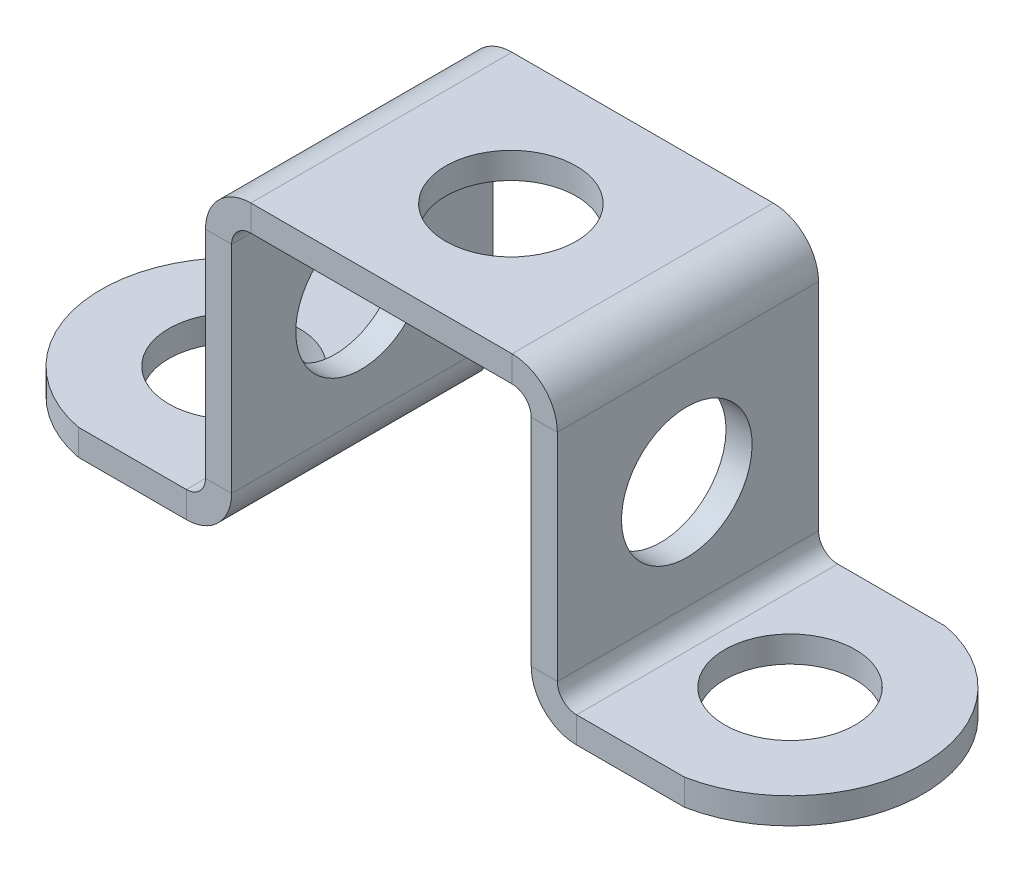
ISO-10303-21;
HEADER;
FILE_DESCRIPTION(('STEP AP214'),'2;1');
FILE_NAME('part.step','',(''),(''),'','','');
FILE_SCHEMA(('AUTOMOTIVE_DESIGN { 1 0 10303 214 1 1 1 1 }'));
ENDSEC;
DATA;
#1=APPLICATION_CONTEXT('core data for automotive mechanical design processes');
#2=APPLICATION_PROTOCOL_DEFINITION('international standard','automotive_design',2000,#1);
#3=PRODUCT_CONTEXT('',#1,'mechanical');
#4=PRODUCT('Part','Part','',(#3));
#5=PRODUCT_RELATED_PRODUCT_CATEGORY('part','',(#4));
#6=PRODUCT_DEFINITION_FORMATION('','',#4);
#7=PRODUCT_DEFINITION_CONTEXT('part definition',#1,'design');
#8=PRODUCT_DEFINITION('design','',#6,#7);
#9=PRODUCT_DEFINITION_SHAPE('','',#8);
#10=(LENGTH_UNIT() NAMED_UNIT(*) SI_UNIT(.MILLI.,.METRE.));
#11=(NAMED_UNIT(*) PLANE_ANGLE_UNIT() SI_UNIT($,.RADIAN.));
#12=(NAMED_UNIT(*) SI_UNIT($,.STERADIAN.) SOLID_ANGLE_UNIT());
#13=UNCERTAINTY_MEASURE_WITH_UNIT(LENGTH_MEASURE(1.E-05),#10,'distance_accuracy_value','');
#14=(GEOMETRIC_REPRESENTATION_CONTEXT(3) GLOBAL_UNCERTAINTY_ASSIGNED_CONTEXT((#13)) GLOBAL_UNIT_ASSIGNED_CONTEXT((#10,
#11,#12)) REPRESENTATION_CONTEXT('',''));
#15=CARTESIAN_POINT('',(0.,0.,0.));
#16=DIRECTION('',(0.,0.,1.));
#17=DIRECTION('',(1.,0.,0.));
#18=AXIS2_PLACEMENT_3D('',#15,#16,#17);
#19=CARTESIAN_POINT('',(0.,-11.7366,0.));
#20=DIRECTION('',(0.,1.,0.));
#21=DIRECTION('',(0.,0.,1.));
#22=AXIS2_PLACEMENT_3D('',#19,#20,#21);
#23=PLANE('',#22);
#24=CARTESIAN_POINT('',(-10.6453609349663,-11.7366,-0.0427871071047388));
#25=DIRECTION('',(0.,1.,0.));
#26=DIRECTION('',(0.,0.,1.));
#27=AXIS2_PLACEMENT_3D('',#24,#25,#26);
#28=CIRCLE('',#27,2.5);
#29=CARTESIAN_POINT('',(-10.6453609349663,-11.7366,2.45721289289526));
#30=VERTEX_POINT('',#29);
#31=EDGE_CURVE('E1138',#30,#30,#28,.T.);
#32=ORIENTED_EDGE('',*,*,#31,.T.);
#33=EDGE_LOOP('',(#32));
#34=FACE_BOUND('',#33,.T.);
#35=CARTESIAN_POINT('',(-10.6453609349663,-11.7366,-0.0427871071047388));
#36=DIRECTION('',(0.,1.,0.));
#37=DIRECTION('',(0.,0.,1.));
#38=AXIS2_PLACEMENT_3D('',#35,#36,#37);
#39=CIRCLE('',#38,5.09123906503376);
#40=CARTESIAN_POINT('',(-11.6049,-11.7366,-5.04278710710474));
#41=VERTEX_POINT('',#40);
#42=CARTESIAN_POINT('',(-11.6049,-11.7366,4.95721289289526));
#43=VERTEX_POINT('',#42);
#44=EDGE_CURVE('E538',#41,#43,#39,.T.);
#45=ORIENTED_EDGE('',*,*,#44,.F.);
#46=DIRECTION('',(1.,0.,0.));
#47=VECTOR('',#46,1.);
#48=CARTESIAN_POINT('',(0.,-11.7366,-5.04278710710474));
#49=LINE('',#48,#47);
#50=CARTESIAN_POINT('',(-7.47320000000003,-11.7366,-5.04278710710474));
#51=VERTEX_POINT('',#50);
#52=EDGE_CURVE('E277',#41,#51,#49,.T.);
#53=ORIENTED_EDGE('',*,*,#52,.T.);
#54=DIRECTION('',(0.,0.,1.));
#55=VECTOR('',#54,1.);
#56=CARTESIAN_POINT('',(-7.47320000000003,-11.7366,-5.04278710710474));
#57=LINE('',#56,#55);
#58=CARTESIAN_POINT('',(-7.47320000000003,-11.7366,4.95721289289526));
#59=VERTEX_POINT('',#58);
#60=EDGE_CURVE('E288',#59,#51,#57,.F.);
#61=ORIENTED_EDGE('',*,*,#60,.F.);
#62=DIRECTION('',(-1.,0.,0.));
#63=VECTOR('',#62,1.);
#64=CARTESIAN_POINT('',(0.,-11.7366,4.95721289289526));
#65=LINE('',#64,#63);
#66=EDGE_CURVE('E283',#59,#43,#65,.T.);
#67=ORIENTED_EDGE('',*,*,#66,.T.);
#68=EDGE_LOOP('',(#45,#53,#61,#67));
#69=FACE_BOUND('',#68,.T.);
#70=ADVANCED_FACE('F121',(#34,#69),#23,.F.);
#71=CARTESIAN_POINT('',(0.,-10.7366,0.));
#72=DIRECTION('',(0.,1.,0.));
#73=DIRECTION('',(0.,0.,1.));
#74=AXIS2_PLACEMENT_3D('',#71,#72,#73);
#75=PLANE('',#74);
#76=CARTESIAN_POINT('',(-10.6453609349663,-10.7366,-0.0427871071047388));
#77=DIRECTION('',(0.,1.,0.));
#78=DIRECTION('',(0.,0.,1.));
#79=AXIS2_PLACEMENT_3D('',#76,#77,#78);
#80=CIRCLE('',#79,2.5);
#81=CARTESIAN_POINT('',(-10.6453609349663,-10.7366,2.45721289289526));
#82=VERTEX_POINT('',#81);
#83=EDGE_CURVE('E1127',#82,#82,#80,.T.);
#84=ORIENTED_EDGE('',*,*,#83,.F.);
#85=EDGE_LOOP('',(#84));
#86=FACE_BOUND('',#85,.T.);
#87=DIRECTION('',(-1.,0.,0.));
#88=VECTOR('',#87,1.);
#89=CARTESIAN_POINT('',(-6.73660000000003,-10.7366,-5.04278710710474));
#90=LINE('',#89,#88);
#91=CARTESIAN_POINT('',(-11.6049,-10.7366,-5.04278710710474));
#92=VERTEX_POINT('',#91);
#93=CARTESIAN_POINT('',(-7.47320000000003,-10.7366,-5.04278710710474));
#94=VERTEX_POINT('',#93);
#95=EDGE_CURVE('E275',#92,#94,#90,.F.);
#96=ORIENTED_EDGE('',*,*,#95,.F.);
#97=CARTESIAN_POINT('',(-10.6453609349663,-10.7366,-0.0427871071047388));
#98=DIRECTION('',(0.,-1.,0.));
#99=DIRECTION('',(0.,0.,1.));
#100=AXIS2_PLACEMENT_3D('',#97,#98,#99);
#101=CIRCLE('',#100,5.09123906503376);
#102=CARTESIAN_POINT('',(-11.6049,-10.7366,4.95721289289526));
#103=VERTEX_POINT('',#102);
#104=EDGE_CURVE('E260',#92,#103,#101,.F.);
#105=ORIENTED_EDGE('',*,*,#104,.T.);
#106=DIRECTION('',(1.,0.,0.));
#107=VECTOR('',#106,1.);
#108=CARTESIAN_POINT('',(-15.7366,-10.7366,4.95721289289526));
#109=LINE('',#108,#107);
#110=CARTESIAN_POINT('',(-7.47320000000003,-10.7366,4.95721289289526));
#111=VERTEX_POINT('',#110);
#112=EDGE_CURVE('E284',#111,#103,#109,.F.);
#113=ORIENTED_EDGE('',*,*,#112,.F.);
#114=DIRECTION('',(0.,0.,1.));
#115=VECTOR('',#114,1.);
#116=CARTESIAN_POINT('',(-7.47320000000003,-10.7366,-5.04278710710474));
#117=LINE('',#116,#115);
#118=EDGE_CURVE('E282',#94,#111,#117,.T.);
#119=ORIENTED_EDGE('',*,*,#118,.F.);
#120=EDGE_LOOP('',(#96,#105,#113,#119));
#121=FACE_BOUND('',#120,.T.);
#122=ADVANCED_FACE('F281',(#86,#121),#75,.T.);
#123=CARTESIAN_POINT('',(-6.73660000000003,-11.7366,-5.04278710710474));
#124=DIRECTION('',(0.,0.,1.));
#125=DIRECTION('',(1.,0.,0.));
#126=AXIS2_PLACEMENT_3D('',#123,#124,#125);
#127=PLANE('',#126);
#128=DIRECTION('',(0.,1.,0.));
#129=VECTOR('',#128,1.);
#130=CARTESIAN_POINT('',(-11.6049,-20.7366,-5.04278710710474));
#131=LINE('',#130,#129);
#132=EDGE_CURVE('E263',#41,#92,#131,.T.);
#133=ORIENTED_EDGE('',*,*,#132,.T.);
#134=ORIENTED_EDGE('',*,*,#95,.T.);
#135=DIRECTION('',(0.,1.,0.));
#136=VECTOR('',#135,1.);
#137=CARTESIAN_POINT('',(-7.47320000000003,-11.7366,-5.04278710710474));
#138=LINE('',#137,#136);
#139=EDGE_CURVE('E298',#94,#51,#138,.F.);
#140=ORIENTED_EDGE('',*,*,#139,.T.);
#141=ORIENTED_EDGE('',*,*,#52,.F.);
#142=EDGE_LOOP('',(#133,#134,#140,#141));
#143=FACE_BOUND('',#142,.T.);
#144=ADVANCED_FACE('F273',(#143),#127,.F.);
#145=CARTESIAN_POINT('',(-15.7366,-11.7366,4.95721289289526));
#146=DIRECTION('',(0.,0.,-1.));
#147=DIRECTION('',(-1.,0.,0.));
#148=AXIS2_PLACEMENT_3D('',#145,#146,#147);
#149=PLANE('',#148);
#150=DIRECTION('',(0.,1.,0.));
#151=VECTOR('',#150,1.);
#152=CARTESIAN_POINT('',(-11.6049,-20.7366,4.95721289289526));
#153=LINE('',#152,#151);
#154=EDGE_CURVE('E266',#43,#103,#153,.T.);
#155=ORIENTED_EDGE('',*,*,#154,.F.);
#156=ORIENTED_EDGE('',*,*,#66,.F.);
#157=DIRECTION('',(0.,1.,0.));
#158=VECTOR('',#157,1.);
#159=CARTESIAN_POINT('',(-7.47320000000003,-10.7366,4.95721289289526));
#160=LINE('',#159,#158);
#161=EDGE_CURVE('E294',#111,#59,#160,.F.);
#162=ORIENTED_EDGE('',*,*,#161,.F.);
#163=ORIENTED_EDGE('',*,*,#112,.T.);
#164=EDGE_LOOP('',(#155,#156,#162,#163));
#165=FACE_BOUND('',#164,.T.);
#166=ADVANCED_FACE('F559',(#165),#149,.F.);
#167=CARTESIAN_POINT('',(0.,-11.7366,0.));
#168=DIRECTION('',(0.,1.,0.));
#169=DIRECTION('',(0.,0.,1.));
#170=AXIS2_PLACEMENT_3D('',#167,#168,#169);
#171=PLANE('',#170);
#172=CARTESIAN_POINT('',(10.6453609349663,-11.7366,-0.0427871071047388));
#173=DIRECTION('',(0.,1.,0.));
#174=DIRECTION('',(0.,0.,1.));
#175=AXIS2_PLACEMENT_3D('',#172,#173,#174);
#176=CIRCLE('',#175,2.5);
#177=CARTESIAN_POINT('',(10.6453609349663,-11.7366,2.45721289289526));
#178=VERTEX_POINT('',#177);
#179=EDGE_CURVE('E1133',#178,#178,#176,.T.);
#180=ORIENTED_EDGE('',*,*,#179,.T.);
#181=EDGE_LOOP('',(#180));
#182=FACE_BOUND('',#181,.T.);
#183=DIRECTION('',(1.,0.,0.));
#184=VECTOR('',#183,1.);
#185=CARTESIAN_POINT('',(0.,-11.7366,-5.04278710710474));
#186=LINE('',#185,#184);
#187=CARTESIAN_POINT('',(7.47320000000003,-11.7366,-5.04278710710474));
#188=VERTEX_POINT('',#187);
#189=CARTESIAN_POINT('',(11.6049,-11.7366,-5.04278710710474));
#190=VERTEX_POINT('',#189);
#191=EDGE_CURVE('E317',#188,#190,#186,.T.);
#192=ORIENTED_EDGE('',*,*,#191,.T.);
#193=CARTESIAN_POINT('',(10.6453609349663,-11.7366,-0.0427871071047388));
#194=DIRECTION('',(0.,1.,0.));
#195=DIRECTION('',(0.,0.,1.));
#196=AXIS2_PLACEMENT_3D('',#193,#194,#195);
#197=CIRCLE('',#196,5.09123906503376);
#198=CARTESIAN_POINT('',(11.6049,-11.7366,4.95721289289526));
#199=VERTEX_POINT('',#198);
#200=EDGE_CURVE('E300',#190,#199,#197,.F.);
#201=ORIENTED_EDGE('',*,*,#200,.T.);
#202=DIRECTION('',(-1.,0.,0.));
#203=VECTOR('',#202,1.);
#204=CARTESIAN_POINT('',(0.,-11.7366,4.95721289289526));
#205=LINE('',#204,#203);
#206=CARTESIAN_POINT('',(7.47320000000003,-11.7366,4.95721289289526));
#207=VERTEX_POINT('',#206);
#208=EDGE_CURVE('E314',#199,#207,#205,.T.);
#209=ORIENTED_EDGE('',*,*,#208,.T.);
#210=DIRECTION('',(0.,0.,-1.));
#211=VECTOR('',#210,1.);
#212=CARTESIAN_POINT('',(7.47320000000003,-11.7366,4.95721289289526));
#213=LINE('',#212,#211);
#214=EDGE_CURVE('E325',#188,#207,#213,.F.);
#215=ORIENTED_EDGE('',*,*,#214,.F.);
#216=EDGE_LOOP('',(#192,#201,#209,#215));
#217=FACE_BOUND('',#216,.T.);
#218=ADVANCED_FACE('F518',(#182,#217),#171,.F.);
#219=CARTESIAN_POINT('',(0.,-10.7366,0.));
#220=DIRECTION('',(0.,1.,0.));
#221=DIRECTION('',(0.,0.,1.));
#222=AXIS2_PLACEMENT_3D('',#219,#220,#221);
#223=PLANE('',#222);
#224=CARTESIAN_POINT('',(10.6453609349663,-10.7366,-0.0427871071047388));
#225=DIRECTION('',(0.,1.,0.));
#226=DIRECTION('',(0.,0.,1.));
#227=AXIS2_PLACEMENT_3D('',#224,#225,#226);
#228=CIRCLE('',#227,2.5);
#229=CARTESIAN_POINT('',(10.6453609349663,-10.7366,2.45721289289526));
#230=VERTEX_POINT('',#229);
#231=EDGE_CURVE('E1130',#230,#230,#228,.T.);
#232=ORIENTED_EDGE('',*,*,#231,.F.);
#233=EDGE_LOOP('',(#232));
#234=FACE_BOUND('',#233,.T.);
#235=CARTESIAN_POINT('',(10.6453609349663,-10.7366,-0.0427871071047388));
#236=DIRECTION('',(0.,1.,0.));
#237=DIRECTION('',(0.,0.,1.));
#238=AXIS2_PLACEMENT_3D('',#235,#236,#237);
#239=CIRCLE('',#238,5.09123906503376);
#240=CARTESIAN_POINT('',(11.6049,-10.7366,-5.04278710710474));
#241=VERTEX_POINT('',#240);
#242=CARTESIAN_POINT('',(11.6049,-10.7366,4.95721289289526));
#243=VERTEX_POINT('',#242);
#244=EDGE_CURVE('E509',#241,#243,#239,.F.);
#245=ORIENTED_EDGE('',*,*,#244,.F.);
#246=DIRECTION('',(-1.,0.,0.));
#247=VECTOR('',#246,1.);
#248=CARTESIAN_POINT('',(15.7366,-10.7366,-5.04278710710474));
#249=LINE('',#248,#247);
#250=CARTESIAN_POINT('',(7.47320000000003,-10.7366,-5.04278710710474));
#251=VERTEX_POINT('',#250);
#252=EDGE_CURVE('E322',#251,#241,#249,.F.);
#253=ORIENTED_EDGE('',*,*,#252,.F.);
#254=DIRECTION('',(0.,0.,-1.));
#255=VECTOR('',#254,1.);
#256=CARTESIAN_POINT('',(7.47320000000003,-10.7366,4.95721289289526));
#257=LINE('',#256,#255);
#258=CARTESIAN_POINT('',(7.47320000000003,-10.7366,4.95721289289526));
#259=VERTEX_POINT('',#258);
#260=EDGE_CURVE('E331',#259,#251,#257,.T.);
#261=ORIENTED_EDGE('',*,*,#260,.F.);
#262=DIRECTION('',(1.,0.,0.));
#263=VECTOR('',#262,1.);
#264=CARTESIAN_POINT('',(6.73660000000003,-10.7366,4.95721289289526));
#265=LINE('',#264,#263);
#266=EDGE_CURVE('E320',#243,#259,#265,.F.);
#267=ORIENTED_EDGE('',*,*,#266,.F.);
#268=EDGE_LOOP('',(#245,#253,#261,#267));
#269=FACE_BOUND('',#268,.T.);
#270=ADVANCED_FACE('F508',(#234,#269),#223,.T.);
#271=CARTESIAN_POINT('',(-5.,-1.,4.95721289289526));
#272=DIRECTION('',(0.,0.,1.));
#273=DIRECTION('',(1.,0.,0.));
#274=AXIS2_PLACEMENT_3D('',#271,#272,#273);
#275=PLANE('',#274);
#276=DIRECTION('',(1.,0.,0.));
#277=VECTOR('',#276,1.);
#278=CARTESIAN_POINT('',(-5.,0.,4.95721289289526));
#279=LINE('',#278,#277);
#280=CARTESIAN_POINT('',(-5.,0.,4.95721289289526));
#281=VERTEX_POINT('',#280);
#282=CARTESIAN_POINT('',(5.,0.,4.95721289289526));
#283=VERTEX_POINT('',#282);
#284=EDGE_CURVE('E437',#281,#283,#279,.T.);
#285=ORIENTED_EDGE('',*,*,#284,.F.);
#286=DIRECTION('',(0.,1.,0.));
#287=VECTOR('',#286,1.);
#288=CARTESIAN_POINT('',(-5.,-1.,4.95721289289526));
#289=LINE('',#288,#287);
#290=CARTESIAN_POINT('',(-5.,-1.,4.95721289289526));
#291=VERTEX_POINT('',#290);
#292=EDGE_CURVE('E130',#291,#281,#289,.T.);
#293=ORIENTED_EDGE('',*,*,#292,.F.);
#294=DIRECTION('',(1.,0.,0.));
#295=VECTOR('',#294,1.);
#296=CARTESIAN_POINT('',(-5.,-1.,4.95721289289526));
#297=LINE('',#296,#295);
#298=CARTESIAN_POINT('',(5.,-1.,4.95721289289526));
#299=VERTEX_POINT('',#298);
#300=EDGE_CURVE('E442',#291,#299,#297,.T.);
#301=ORIENTED_EDGE('',*,*,#300,.T.);
#302=DIRECTION('',(0.,1.,0.));
#303=VECTOR('',#302,1.);
#304=CARTESIAN_POINT('',(5.,-1.,4.95721289289526));
#305=LINE('',#304,#303);
#306=EDGE_CURVE('E13',#299,#283,#305,.T.);
#307=ORIENTED_EDGE('',*,*,#306,.T.);
#308=EDGE_LOOP('',(#285,#293,#301,#307));
#309=FACE_BOUND('',#308,.T.);
#310=ADVANCED_FACE('F473',(#309),#275,.T.);
#311=CARTESIAN_POINT('',(-5.,-1.,-5.04278710710474));
#312=DIRECTION('',(0.,0.,-1.));
#313=DIRECTION('',(-1.,0.,0.));
#314=AXIS2_PLACEMENT_3D('',#311,#312,#313);
#315=PLANE('',#314);
#316=DIRECTION('',(-1.,0.,0.));
#317=VECTOR('',#316,1.);
#318=CARTESIAN_POINT('',(-5.,0.,-5.04278710710474));
#319=LINE('',#318,#317);
#320=CARTESIAN_POINT('',(5.,0.,-5.04278710710474));
#321=VERTEX_POINT('',#320);
#322=CARTESIAN_POINT('',(-5.,0.,-5.04278710710474));
#323=VERTEX_POINT('',#322);
#324=EDGE_CURVE('E447',#321,#323,#319,.T.);
#325=ORIENTED_EDGE('',*,*,#324,.F.);
#326=DIRECTION('',(0.,1.,0.));
#327=VECTOR('',#326,1.);
#328=CARTESIAN_POINT('',(5.,-1.,-5.04278710710474));
#329=LINE('',#328,#327);
#330=CARTESIAN_POINT('',(5.,-1.,-5.04278710710474));
#331=VERTEX_POINT('',#330);
#332=EDGE_CURVE('E125',#331,#321,#329,.T.);
#333=ORIENTED_EDGE('',*,*,#332,.F.);
#334=DIRECTION('',(-1.,0.,0.));
#335=VECTOR('',#334,1.);
#336=CARTESIAN_POINT('',(-5.,-1.,-5.04278710710474));
#337=LINE('',#336,#335);
#338=CARTESIAN_POINT('',(-5.,-1.,-5.04278710710474));
#339=VERTEX_POINT('',#338);
#340=EDGE_CURVE('E436',#331,#339,#337,.T.);
#341=ORIENTED_EDGE('',*,*,#340,.T.);
#342=DIRECTION('',(0.,1.,0.));
#343=VECTOR('',#342,1.);
#344=CARTESIAN_POINT('',(-5.,-1.,-5.04278710710474));
#345=LINE('',#344,#343);
#346=EDGE_CURVE('E455',#339,#323,#345,.T.);
#347=ORIENTED_EDGE('',*,*,#346,.T.);
#348=EDGE_LOOP('',(#325,#333,#341,#347));
#349=FACE_BOUND('',#348,.T.);
#350=ADVANCED_FACE('F123',(#349),#315,.T.);
#351=CARTESIAN_POINT('',(0.,-1.,0.));
#352=DIRECTION('',(0.,1.,0.));
#353=DIRECTION('',(0.,0.,1.));
#354=AXIS2_PLACEMENT_3D('',#351,#352,#353);
#355=PLANE('',#354);
#356=CARTESIAN_POINT('',(0.,-0.999999999999999,0.));
#357=DIRECTION('',(0.,1.,0.));
#358=DIRECTION('',(0.,0.,1.));
#359=AXIS2_PLACEMENT_3D('',#356,#357,#358);
#360=CIRCLE('',#359,2.5);
#361=CARTESIAN_POINT('',(0.,-0.999999999999999,2.5));
#362=VERTEX_POINT('',#361);
#363=EDGE_CURVE('E278',#362,#362,#360,.T.);
#364=ORIENTED_EDGE('',*,*,#363,.T.);
#365=EDGE_LOOP('',(#364));
#366=FACE_BOUND('',#365,.T.);
#367=DIRECTION('',(0.,0.,-1.));
#368=VECTOR('',#367,1.);
#369=CARTESIAN_POINT('',(5.,-1.,-5.04278710710474));
#370=LINE('',#369,#368);
#371=EDGE_CURVE('E434',#299,#331,#370,.T.);
#372=ORIENTED_EDGE('',*,*,#371,.F.);
#373=ORIENTED_EDGE('',*,*,#300,.F.);
#374=DIRECTION('',(0.,0.,1.));
#375=VECTOR('',#374,1.);
#376=CARTESIAN_POINT('',(-5.,-1.,-5.04278710710474));
#377=LINE('',#376,#375);
#378=EDGE_CURVE('E440',#339,#291,#377,.T.);
#379=ORIENTED_EDGE('',*,*,#378,.F.);
#380=ORIENTED_EDGE('',*,*,#340,.F.);
#381=EDGE_LOOP('',(#372,#373,#379,#380));
#382=FACE_BOUND('',#381,.T.);
#383=ADVANCED_FACE('F479',(#366,#382),#355,.F.);
#384=CARTESIAN_POINT('',(0.,0.,0.));
#385=DIRECTION('',(0.,1.,0.));
#386=DIRECTION('',(0.,0.,1.));
#387=AXIS2_PLACEMENT_3D('',#384,#385,#386);
#388=PLANE('',#387);
#389=CARTESIAN_POINT('',(0.,0.,0.));
#390=DIRECTION('',(0.,1.,0.));
#391=DIRECTION('',(0.,0.,1.));
#392=AXIS2_PLACEMENT_3D('',#389,#390,#391);
#393=CIRCLE('',#392,2.5);
#394=CARTESIAN_POINT('',(0.,0.,2.5));
#395=VERTEX_POINT('',#394);
#396=EDGE_CURVE('E1140',#395,#395,#393,.T.);
#397=ORIENTED_EDGE('',*,*,#396,.F.);
#398=EDGE_LOOP('',(#397));
#399=FACE_BOUND('',#398,.T.);
#400=DIRECTION('',(0.,0.,-1.));
#401=VECTOR('',#400,1.);
#402=CARTESIAN_POINT('',(5.,0.,-5.04278710710474));
#403=LINE('',#402,#401);
#404=EDGE_CURVE('E425',#283,#321,#403,.T.);
#405=ORIENTED_EDGE('',*,*,#404,.T.);
#406=ORIENTED_EDGE('',*,*,#324,.T.);
#407=DIRECTION('',(0.,0.,1.));
#408=VECTOR('',#407,1.);
#409=CARTESIAN_POINT('',(-5.,0.,-5.04278710710474));
#410=LINE('',#409,#408);
#411=EDGE_CURVE('E450',#323,#281,#410,.T.);
#412=ORIENTED_EDGE('',*,*,#411,.T.);
#413=ORIENTED_EDGE('',*,*,#284,.T.);
#414=EDGE_LOOP('',(#405,#406,#412,#413));
#415=FACE_BOUND('',#414,.T.);
#416=ADVANCED_FACE('F465',(#399,#415),#388,.T.);
#417=CARTESIAN_POINT('',(5.,-1.7366,-5.04278710710474));
#418=DIRECTION('',(0.,0.,-1.));
#419=DIRECTION('',(-1.,0.,0.));
#420=AXIS2_PLACEMENT_3D('',#417,#418,#419);
#421=PLANE('',#420);
#422=DIRECTION('',(1.,0.,0.));
#423=VECTOR('',#422,1.);
#424=CARTESIAN_POINT('',(6.7366,-1.73659999999999,-5.04278710710474));
#425=LINE('',#424,#423);
#426=CARTESIAN_POINT('',(5.7366,-1.7366,-5.04278710710474));
#427=VERTEX_POINT('',#426);
#428=CARTESIAN_POINT('',(6.7366,-1.73659999999999,-5.04278710710474));
#429=VERTEX_POINT('',#428);
#430=EDGE_CURVE('E381',#427,#429,#425,.T.);
#431=ORIENTED_EDGE('',*,*,#430,.F.);
#432=CARTESIAN_POINT('',(5.,-1.7366,-5.04278710710474));
#433=DIRECTION('',(0.,0.,1.));
#434=DIRECTION('',(1.,0.,0.));
#435=AXIS2_PLACEMENT_3D('',#432,#433,#434);
#436=CIRCLE('',#435,0.7366);
#437=EDGE_CURVE('E429',#331,#427,#436,.F.);
#438=ORIENTED_EDGE('',*,*,#437,.F.);
#439=ORIENTED_EDGE('',*,*,#332,.T.);
#440=CARTESIAN_POINT('',(5.,-1.7366,-5.04278710710474));
#441=DIRECTION('',(0.,0.,1.));
#442=DIRECTION('',(1.,0.,0.));
#443=AXIS2_PLACEMENT_3D('',#440,#441,#442);
#444=CIRCLE('',#443,1.7366);
#445=EDGE_CURVE('E146',#321,#429,#444,.F.);
#446=ORIENTED_EDGE('',*,*,#445,.T.);
#447=EDGE_LOOP('',(#431,#438,#439,#446));
#448=FACE_BOUND('',#447,.T.);
#449=ADVANCED_FACE('F462',(#448),#421,.T.);
#450=CARTESIAN_POINT('',(5.,-1.7366,4.95721289289526));
#451=DIRECTION('',(0.,0.,-1.));
#452=DIRECTION('',(-1.,0.,0.));
#453=AXIS2_PLACEMENT_3D('',#450,#451,#452);
#454=PLANE('',#453);
#455=CARTESIAN_POINT('',(5.,-1.7366,4.95721289289526));
#456=DIRECTION('',(0.,0.,1.));
#457=DIRECTION('',(1.,0.,0.));
#458=AXIS2_PLACEMENT_3D('',#455,#456,#457);
#459=CIRCLE('',#458,0.7366);
#460=CARTESIAN_POINT('',(5.7366,-1.7366,4.95721289289526));
#461=VERTEX_POINT('',#460);
#462=EDGE_CURVE('E393',#461,#299,#459,.T.);
#463=ORIENTED_EDGE('',*,*,#462,.F.);
#464=DIRECTION('',(1.,0.,0.));
#465=VECTOR('',#464,1.);
#466=CARTESIAN_POINT('',(5.7366,-1.7366,4.95721289289526));
#467=LINE('',#466,#465);
#468=CARTESIAN_POINT('',(6.7366,-1.73659999999999,4.95721289289526));
#469=VERTEX_POINT('',#468);
#470=EDGE_CURVE('E417',#461,#469,#467,.T.);
#471=ORIENTED_EDGE('',*,*,#470,.T.);
#472=CARTESIAN_POINT('',(5.,-1.7366,4.95721289289526));
#473=DIRECTION('',(0.,0.,1.));
#474=DIRECTION('',(1.,0.,0.));
#475=AXIS2_PLACEMENT_3D('',#472,#473,#474);
#476=CIRCLE('',#475,1.7366);
#477=EDGE_CURVE('E426',#469,#283,#476,.T.);
#478=ORIENTED_EDGE('',*,*,#477,.T.);
#479=ORIENTED_EDGE('',*,*,#306,.F.);
#480=EDGE_LOOP('',(#463,#471,#478,#479));
#481=FACE_BOUND('',#480,.T.);
#482=ADVANCED_FACE('F470',(#481),#454,.F.);
#483=CARTESIAN_POINT('',(5.,-1.7366,4.95721289289526));
#484=DIRECTION('',(0.,0.,1.));
#485=DIRECTION('',(1.,0.,0.));
#486=AXIS2_PLACEMENT_3D('',#483,#484,#485);
#487=CYLINDRICAL_SURFACE('',#486,1.7366);
#488=ORIENTED_EDGE('',*,*,#404,.F.);
#489=ORIENTED_EDGE('',*,*,#477,.F.);
#490=DIRECTION('',(0.,0.,1.));
#491=VECTOR('',#490,1.);
#492=CARTESIAN_POINT('',(6.7366,-1.73659999999999,0.));
#493=LINE('',#492,#491);
#494=EDGE_CURVE('E414',#429,#469,#493,.T.);
#495=ORIENTED_EDGE('',*,*,#494,.F.);
#496=ORIENTED_EDGE('',*,*,#445,.F.);
#497=EDGE_LOOP('',(#488,#489,#495,#496));
#498=FACE_BOUND('',#497,.T.);
#499=ADVANCED_FACE('F467',(#498),#487,.T.);
#500=CARTESIAN_POINT('',(5.,-1.7366,4.95721289289526));
#501=DIRECTION('',(0.,0.,1.));
#502=DIRECTION('',(1.,0.,0.));
#503=AXIS2_PLACEMENT_3D('',#500,#501,#502);
#504=CYLINDRICAL_SURFACE('',#503,0.7366);
#505=ORIENTED_EDGE('',*,*,#371,.T.);
#506=ORIENTED_EDGE('',*,*,#437,.T.);
#507=DIRECTION('',(0.,0.,-1.));
#508=VECTOR('',#507,1.);
#509=CARTESIAN_POINT('',(5.7366,-1.7366,-5.04278710710474));
#510=LINE('',#509,#508);
#511=EDGE_CURVE('E420',#427,#461,#510,.F.);
#512=ORIENTED_EDGE('',*,*,#511,.T.);
#513=ORIENTED_EDGE('',*,*,#462,.T.);
#514=EDGE_LOOP('',(#505,#506,#512,#513));
#515=FACE_BOUND('',#514,.T.);
#516=ADVANCED_FACE('F481',(#515),#504,.F.);
#517=CARTESIAN_POINT('',(6.7366,-0.999999999999997,4.95721289289526));
#518=DIRECTION('',(0.,0.,1.));
#519=DIRECTION('',(1.,0.,0.));
#520=AXIS2_PLACEMENT_3D('',#517,#518,#519);
#521=PLANE('',#520);
#522=DIRECTION('',(0.,1.,0.));
#523=VECTOR('',#522,1.);
#524=CARTESIAN_POINT('',(6.7366,-0.999999999999997,4.95721289289526));
#525=LINE('',#524,#523);
#526=CARTESIAN_POINT('',(6.73660000000004,-10.,4.95721289289526));
#527=VERTEX_POINT('',#526);
#528=EDGE_CURVE('E397',#527,#469,#525,.T.);
#529=ORIENTED_EDGE('',*,*,#528,.T.);
#530=ORIENTED_EDGE('',*,*,#470,.F.);
#531=DIRECTION('',(0.,-1.,0.));
#532=VECTOR('',#531,1.);
#533=CARTESIAN_POINT('',(5.73659999999999,0.,4.95721289289526));
#534=LINE('',#533,#532);
#535=CARTESIAN_POINT('',(5.73660000000003,-10.,4.95721289289526));
#536=VERTEX_POINT('',#535);
#537=EDGE_CURVE('E405',#536,#461,#534,.F.);
#538=ORIENTED_EDGE('',*,*,#537,.F.);
#539=DIRECTION('',(-1.,0.,0.));
#540=VECTOR('',#539,1.);
#541=CARTESIAN_POINT('',(6.73660000000003,-10.,4.95721289289526));
#542=LINE('',#541,#540);
#543=EDGE_CURVE('E390',#527,#536,#542,.T.);
#544=ORIENTED_EDGE('',*,*,#543,.F.);
#545=EDGE_LOOP('',(#529,#530,#538,#544));
#546=FACE_BOUND('',#545,.T.);
#547=ADVANCED_FACE('F489',(#546),#521,.T.);
#548=CARTESIAN_POINT('',(6.73660000000003,-10.,-5.04278710710474));
#549=DIRECTION('',(0.,0.,-1.));
#550=DIRECTION('',(-1.,0.,0.));
#551=AXIS2_PLACEMENT_3D('',#548,#549,#550);
#552=PLANE('',#551);
#553=DIRECTION('',(0.,1.,0.));
#554=VECTOR('',#553,1.);
#555=CARTESIAN_POINT('',(5.73659999999999,0.,-5.04278710710474));
#556=LINE('',#555,#554);
#557=CARTESIAN_POINT('',(5.73660000000004,-10.,-5.04278710710474));
#558=VERTEX_POINT('',#557);
#559=EDGE_CURVE('E411',#427,#558,#556,.F.);
#560=ORIENTED_EDGE('',*,*,#559,.F.);
#561=ORIENTED_EDGE('',*,*,#430,.T.);
#562=DIRECTION('',(0.,-1.,0.));
#563=VECTOR('',#562,1.);
#564=CARTESIAN_POINT('',(6.73660000000003,-10.,-5.04278710710474));
#565=LINE('',#564,#563);
#566=CARTESIAN_POINT('',(6.73660000000004,-10.,-5.04278710710474));
#567=VERTEX_POINT('',#566);
#568=EDGE_CURVE('E402',#429,#567,#565,.T.);
#569=ORIENTED_EDGE('',*,*,#568,.T.);
#570=DIRECTION('',(-1.,0.,0.));
#571=VECTOR('',#570,1.);
#572=CARTESIAN_POINT('',(6.73660000000003,-10.,-5.04278710710474));
#573=LINE('',#572,#571);
#574=EDGE_CURVE('E394',#567,#558,#573,.T.);
#575=ORIENTED_EDGE('',*,*,#574,.T.);
#576=EDGE_LOOP('',(#560,#561,#569,#575));
#577=FACE_BOUND('',#576,.T.);
#578=ADVANCED_FACE('F496',(#577),#552,.T.);
#579=CARTESIAN_POINT('',(6.7366,0.,0.));
#580=DIRECTION('',(1.,0.,0.));
#581=DIRECTION('',(0.,1.,0.));
#582=AXIS2_PLACEMENT_3D('',#579,#580,#581);
#583=PLANE('',#582);
#584=CARTESIAN_POINT('',(6.73660000000002,-5.8683,0.));
#585=DIRECTION('',(1.,0.,0.));
#586=DIRECTION('',(0.,1.,0.));
#587=AXIS2_PLACEMENT_3D('',#584,#585,#586);
#588=CIRCLE('',#587,2.5);
#589=CARTESIAN_POINT('',(6.73660000000001,-3.3683,0.));
#590=VERTEX_POINT('',#589);
#591=EDGE_CURVE('E1121',#590,#590,#588,.T.);
#592=ORIENTED_EDGE('',*,*,#591,.F.);
#593=EDGE_LOOP('',(#592));
#594=FACE_BOUND('',#593,.T.);
#595=ORIENTED_EDGE('',*,*,#568,.F.);
#596=ORIENTED_EDGE('',*,*,#494,.T.);
#597=ORIENTED_EDGE('',*,*,#528,.F.);
#598=DIRECTION('',(0.,0.,1.));
#599=VECTOR('',#598,1.);
#600=CARTESIAN_POINT('',(6.73660000000003,-10.,4.95721289289526));
#601=LINE('',#600,#599);
#602=EDGE_CURVE('E400',#567,#527,#601,.T.);
#603=ORIENTED_EDGE('',*,*,#602,.F.);
#604=EDGE_LOOP('',(#595,#596,#597,#603));
#605=FACE_BOUND('',#604,.T.);
#606=ADVANCED_FACE('F494',(#594,#605),#583,.T.);
#607=CARTESIAN_POINT('',(5.73659999999999,0.,0.));
#608=DIRECTION('',(1.,0.,0.));
#609=DIRECTION('',(0.,1.,0.));
#610=AXIS2_PLACEMENT_3D('',#607,#608,#609);
#611=PLANE('',#610);
#612=CARTESIAN_POINT('',(5.73660000000002,-5.86830000000001,0.));
#613=DIRECTION('',(1.,0.,0.));
#614=DIRECTION('',(0.,1.,0.));
#615=AXIS2_PLACEMENT_3D('',#612,#613,#614);
#616=CIRCLE('',#615,2.5);
#617=CARTESIAN_POINT('',(5.73660000000001,-3.36830000000001,0.));
#618=VERTEX_POINT('',#617);
#619=EDGE_CURVE('E1124',#618,#618,#616,.T.);
#620=ORIENTED_EDGE('',*,*,#619,.T.);
#621=EDGE_LOOP('',(#620));
#622=FACE_BOUND('',#621,.T.);
#623=ORIENTED_EDGE('',*,*,#511,.F.);
#624=ORIENTED_EDGE('',*,*,#559,.T.);
#625=DIRECTION('',(0.,0.,-1.));
#626=VECTOR('',#625,1.);
#627=CARTESIAN_POINT('',(5.73660000000003,-10.,0.));
#628=LINE('',#627,#626);
#629=EDGE_CURVE('E408',#558,#536,#628,.F.);
#630=ORIENTED_EDGE('',*,*,#629,.T.);
#631=ORIENTED_EDGE('',*,*,#537,.T.);
#632=EDGE_LOOP('',(#623,#624,#630,#631));
#633=FACE_BOUND('',#632,.T.);
#634=ADVANCED_FACE('F485',(#622,#633),#611,.F.);
#635=CARTESIAN_POINT('',(-5.,-1.7366,4.95721289289526));
#636=DIRECTION('',(0.,0.,1.));
#637=DIRECTION('',(1.,0.,0.));
#638=AXIS2_PLACEMENT_3D('',#635,#636,#637);
#639=PLANE('',#638);
#640=DIRECTION('',(-1.,0.,0.));
#641=VECTOR('',#640,1.);
#642=CARTESIAN_POINT('',(-6.7366,-1.73659999999999,4.95721289289526));
#643=LINE('',#642,#641);
#644=CARTESIAN_POINT('',(-5.7366,-1.7366,4.95721289289526));
#645=VERTEX_POINT('',#644);
#646=CARTESIAN_POINT('',(-6.7366,-1.73659999999999,4.95721289289526));
#647=VERTEX_POINT('',#646);
#648=EDGE_CURVE('E338',#645,#647,#643,.T.);
#649=ORIENTED_EDGE('',*,*,#648,.F.);
#650=CARTESIAN_POINT('',(-5.,-1.7366,4.95721289289526));
#651=DIRECTION('',(0.,0.,-1.));
#652=DIRECTION('',(-1.,0.,0.));
#653=AXIS2_PLACEMENT_3D('',#650,#651,#652);
#654=CIRCLE('',#653,0.7366);
#655=EDGE_CURVE('E385',#291,#645,#654,.F.);
#656=ORIENTED_EDGE('',*,*,#655,.F.);
#657=ORIENTED_EDGE('',*,*,#292,.T.);
#658=CARTESIAN_POINT('',(-5.,-1.7366,4.95721289289526));
#659=DIRECTION('',(0.,0.,-1.));
#660=DIRECTION('',(-1.,0.,0.));
#661=AXIS2_PLACEMENT_3D('',#658,#659,#660);
#662=CIRCLE('',#661,1.7366);
#663=EDGE_CURVE('E138',#281,#647,#662,.F.);
#664=ORIENTED_EDGE('',*,*,#663,.T.);
#665=EDGE_LOOP('',(#649,#656,#657,#664));
#666=FACE_BOUND('',#665,.T.);
#667=ADVANCED_FACE('F633',(#666),#639,.T.);
#668=CARTESIAN_POINT('',(-5.,-1.7366,-5.04278710710474));
#669=DIRECTION('',(0.,0.,1.));
#670=DIRECTION('',(1.,0.,0.));
#671=AXIS2_PLACEMENT_3D('',#668,#669,#670);
#672=PLANE('',#671);
#673=CARTESIAN_POINT('',(-5.,-1.7366,-5.04278710710474));
#674=DIRECTION('',(0.,0.,-1.));
#675=DIRECTION('',(-1.,0.,0.));
#676=AXIS2_PLACEMENT_3D('',#673,#674,#675);
#677=CIRCLE('',#676,0.7366);
#678=CARTESIAN_POINT('',(-5.7366,-1.7366,-5.04278710710474));
#679=VERTEX_POINT('',#678);
#680=EDGE_CURVE('E350',#679,#339,#677,.T.);
#681=ORIENTED_EDGE('',*,*,#680,.F.);
#682=DIRECTION('',(-1.,0.,0.));
#683=VECTOR('',#682,1.);
#684=CARTESIAN_POINT('',(-5.7366,-1.7366,-5.04278710710474));
#685=LINE('',#684,#683);
#686=CARTESIAN_POINT('',(-6.7366,-1.73659999999999,-5.04278710710474));
#687=VERTEX_POINT('',#686);
#688=EDGE_CURVE('E373',#679,#687,#685,.T.);
#689=ORIENTED_EDGE('',*,*,#688,.T.);
#690=CARTESIAN_POINT('',(-5.,-1.7366,-5.04278710710474));
#691=DIRECTION('',(0.,0.,-1.));
#692=DIRECTION('',(-1.,0.,0.));
#693=AXIS2_PLACEMENT_3D('',#690,#691,#692);
#694=CIRCLE('',#693,1.7366);
#695=EDGE_CURVE('E382',#687,#323,#694,.T.);
#696=ORIENTED_EDGE('',*,*,#695,.T.);
#697=ORIENTED_EDGE('',*,*,#346,.F.);
#698=EDGE_LOOP('',(#681,#689,#696,#697));
#699=FACE_BOUND('',#698,.T.);
#700=ADVANCED_FACE('F629',(#699),#672,.F.);
#701=CARTESIAN_POINT('',(-5.,-1.7366,-5.04278710710474));
#702=DIRECTION('',(0.,0.,-1.));
#703=DIRECTION('',(-1.,0.,0.));
#704=AXIS2_PLACEMENT_3D('',#701,#702,#703);
#705=CYLINDRICAL_SURFACE('',#704,1.7366);
#706=ORIENTED_EDGE('',*,*,#411,.F.);
#707=ORIENTED_EDGE('',*,*,#695,.F.);
#708=DIRECTION('',(0.,0.,-1.));
#709=VECTOR('',#708,1.);
#710=CARTESIAN_POINT('',(-6.7366,-1.73659999999999,4.95721289289526));
#711=LINE('',#710,#709);
#712=EDGE_CURVE('E371',#687,#647,#711,.F.);
#713=ORIENTED_EDGE('',*,*,#712,.T.);
#714=ORIENTED_EDGE('',*,*,#663,.F.);
#715=EDGE_LOOP('',(#706,#707,#713,#714));
#716=FACE_BOUND('',#715,.T.);
#717=ADVANCED_FACE('F626',(#716),#705,.T.);
#718=CARTESIAN_POINT('',(-5.,-1.7366,-5.04278710710474));
#719=DIRECTION('',(0.,0.,-1.));
#720=DIRECTION('',(-1.,0.,0.));
#721=AXIS2_PLACEMENT_3D('',#718,#719,#720);
#722=CYLINDRICAL_SURFACE('',#721,0.7366);
#723=ORIENTED_EDGE('',*,*,#378,.T.);
#724=ORIENTED_EDGE('',*,*,#655,.T.);
#725=DIRECTION('',(0.,0.,-1.));
#726=VECTOR('',#725,1.);
#727=CARTESIAN_POINT('',(-5.7366,-1.7366,4.95721289289526));
#728=LINE('',#727,#726);
#729=EDGE_CURVE('E376',#645,#679,#728,.T.);
#730=ORIENTED_EDGE('',*,*,#729,.T.);
#731=ORIENTED_EDGE('',*,*,#680,.T.);
#732=EDGE_LOOP('',(#723,#724,#730,#731));
#733=FACE_BOUND('',#732,.T.);
#734=ADVANCED_FACE('F624',(#733),#722,.F.);
#735=CARTESIAN_POINT('',(-6.7366,-0.999999999999997,4.95721289289526));
#736=DIRECTION('',(0.,0.,1.));
#737=DIRECTION('',(1.,0.,0.));
#738=AXIS2_PLACEMENT_3D('',#735,#736,#737);
#739=PLANE('',#738);
#740=DIRECTION('',(0.,-1.,0.));
#741=VECTOR('',#740,1.);
#742=CARTESIAN_POINT('',(-5.73659999999999,0.,4.95721289289526));
#743=LINE('',#742,#741);
#744=CARTESIAN_POINT('',(-5.73660000000002,-10.,4.95721289289526));
#745=VERTEX_POINT('',#744);
#746=EDGE_CURVE('E368',#645,#745,#743,.T.);
#747=ORIENTED_EDGE('',*,*,#746,.F.);
#748=ORIENTED_EDGE('',*,*,#648,.T.);
#749=DIRECTION('',(0.,1.,0.));
#750=VECTOR('',#749,1.);
#751=CARTESIAN_POINT('',(-6.7366,-0.999999999999997,4.95721289289526));
#752=LINE('',#751,#750);
#753=CARTESIAN_POINT('',(-6.73660000000002,-10.,4.95721289289526));
#754=VERTEX_POINT('',#753);
#755=EDGE_CURVE('E359',#647,#754,#752,.F.);
#756=ORIENTED_EDGE('',*,*,#755,.T.);
#757=DIRECTION('',(1.,0.,0.));
#758=VECTOR('',#757,1.);
#759=CARTESIAN_POINT('',(-6.73660000000003,-10.,4.95721289289526));
#760=LINE('',#759,#758);
#761=EDGE_CURVE('E351',#754,#745,#760,.T.);
#762=ORIENTED_EDGE('',*,*,#761,.T.);
#763=EDGE_LOOP('',(#747,#748,#756,#762));
#764=FACE_BOUND('',#763,.T.);
#765=ADVANCED_FACE('F621',(#764),#739,.T.);
#766=CARTESIAN_POINT('',(-6.73660000000003,-10.,-5.04278710710474));
#767=DIRECTION('',(0.,0.,-1.));
#768=DIRECTION('',(-1.,0.,0.));
#769=AXIS2_PLACEMENT_3D('',#766,#767,#768);
#770=PLANE('',#769);
#771=DIRECTION('',(0.,-1.,0.));
#772=VECTOR('',#771,1.);
#773=CARTESIAN_POINT('',(-6.73660000000003,-10.,-5.04278710710474));
#774=LINE('',#773,#772);
#775=CARTESIAN_POINT('',(-6.73660000000002,-9.99999999999999,-5.04278710710474));
#776=VERTEX_POINT('',#775);
#777=EDGE_CURVE('E354',#776,#687,#774,.F.);
#778=ORIENTED_EDGE('',*,*,#777,.T.);
#779=ORIENTED_EDGE('',*,*,#688,.F.);
#780=DIRECTION('',(0.,1.,0.));
#781=VECTOR('',#780,1.);
#782=CARTESIAN_POINT('',(-5.73659999999999,0.,-5.04278710710474));
#783=LINE('',#782,#781);
#784=CARTESIAN_POINT('',(-5.73660000000003,-10.,-5.04278710710474));
#785=VERTEX_POINT('',#784);
#786=EDGE_CURVE('E362',#785,#679,#783,.T.);
#787=ORIENTED_EDGE('',*,*,#786,.F.);
#788=DIRECTION('',(1.,0.,0.));
#789=VECTOR('',#788,1.);
#790=CARTESIAN_POINT('',(-6.73660000000003,-10.,-5.04278710710474));
#791=LINE('',#790,#789);
#792=EDGE_CURVE('E347',#776,#785,#791,.T.);
#793=ORIENTED_EDGE('',*,*,#792,.F.);
#794=EDGE_LOOP('',(#778,#779,#787,#793));
#795=FACE_BOUND('',#794,.T.);
#796=ADVANCED_FACE('F549',(#795),#770,.T.);
#797=CARTESIAN_POINT('',(-6.73659999999999,0.,0.));
#798=DIRECTION('',(1.,0.,0.));
#799=DIRECTION('',(0.,1.,0.));
#800=AXIS2_PLACEMENT_3D('',#797,#798,#799);
#801=PLANE('',#800);
#802=CARTESIAN_POINT('',(-6.73660000000002,-5.8683,0.));
#803=DIRECTION('',(1.,0.,0.));
#804=DIRECTION('',(0.,1.,0.));
#805=AXIS2_PLACEMENT_3D('',#802,#803,#804);
#806=CIRCLE('',#805,2.5);
#807=CARTESIAN_POINT('',(-6.73660000000001,-3.3683,0.));
#808=VERTEX_POINT('',#807);
#809=EDGE_CURVE('E1119',#808,#808,#806,.T.);
#810=ORIENTED_EDGE('',*,*,#809,.T.);
#811=EDGE_LOOP('',(#810));
#812=FACE_BOUND('',#811,.T.);
#813=ORIENTED_EDGE('',*,*,#712,.F.);
#814=ORIENTED_EDGE('',*,*,#777,.F.);
#815=DIRECTION('',(0.,0.,1.));
#816=VECTOR('',#815,1.);
#817=CARTESIAN_POINT('',(-6.73660000000003,-10.,4.95721289289526));
#818=LINE('',#817,#816);
#819=EDGE_CURVE('E357',#754,#776,#818,.F.);
#820=ORIENTED_EDGE('',*,*,#819,.F.);
#821=ORIENTED_EDGE('',*,*,#755,.F.);
#822=EDGE_LOOP('',(#813,#814,#820,#821));
#823=FACE_BOUND('',#822,.T.);
#824=ADVANCED_FACE('F612',(#812,#823),#801,.F.);
#825=CARTESIAN_POINT('',(-5.73659999999999,0.,0.));
#826=DIRECTION('',(1.,0.,0.));
#827=DIRECTION('',(0.,1.,0.));
#828=AXIS2_PLACEMENT_3D('',#825,#826,#827);
#829=PLANE('',#828);
#830=CARTESIAN_POINT('',(-5.73660000000002,-5.86830000000001,0.));
#831=DIRECTION('',(1.,0.,0.));
#832=DIRECTION('',(0.,1.,0.));
#833=AXIS2_PLACEMENT_3D('',#830,#831,#832);
#834=CIRCLE('',#833,2.5);
#835=CARTESIAN_POINT('',(-5.73660000000001,-3.36830000000001,0.));
#836=VERTEX_POINT('',#835);
#837=EDGE_CURVE('E1116',#836,#836,#834,.T.);
#838=ORIENTED_EDGE('',*,*,#837,.F.);
#839=EDGE_LOOP('',(#838));
#840=FACE_BOUND('',#839,.T.);
#841=ORIENTED_EDGE('',*,*,#786,.T.);
#842=ORIENTED_EDGE('',*,*,#729,.F.);
#843=ORIENTED_EDGE('',*,*,#746,.T.);
#844=DIRECTION('',(0.,0.,-1.));
#845=VECTOR('',#844,1.);
#846=CARTESIAN_POINT('',(-5.73660000000003,-10.,0.));
#847=LINE('',#846,#845);
#848=EDGE_CURVE('E365',#745,#785,#847,.T.);
#849=ORIENTED_EDGE('',*,*,#848,.T.);
#850=EDGE_LOOP('',(#841,#842,#843,#849));
#851=FACE_BOUND('',#850,.T.);
#852=ADVANCED_FACE('F552',(#840,#851),#829,.T.);
#853=CARTESIAN_POINT('',(7.47320000000003,-10.,4.95721289289526));
#854=DIRECTION('',(0.,0.,1.));
#855=DIRECTION('',(0.,-1.,0.));
#856=AXIS2_PLACEMENT_3D('',#853,#854,#855);
#857=PLANE('',#856);
#858=DIRECTION('',(0.,1.,0.));
#859=VECTOR('',#858,1.);
#860=CARTESIAN_POINT('',(7.47320000000003,-11.7366,4.95721289289526));
#861=LINE('',#860,#859);
#862=EDGE_CURVE('E304',#259,#207,#861,.F.);
#863=ORIENTED_EDGE('',*,*,#862,.F.);
#864=CARTESIAN_POINT('',(7.47320000000003,-10.,4.95721289289526));
#865=DIRECTION('',(0.,0.,-1.));
#866=DIRECTION('',(0.,1.,0.));
#867=AXIS2_PLACEMENT_3D('',#864,#865,#866);
#868=CIRCLE('',#867,0.736599999999993);
#869=EDGE_CURVE('E342',#527,#259,#868,.F.);
#870=ORIENTED_EDGE('',*,*,#869,.F.);
#871=ORIENTED_EDGE('',*,*,#543,.T.);
#872=CARTESIAN_POINT('',(7.47320000000003,-10.,4.95721289289526));
#873=DIRECTION('',(0.,0.,-1.));
#874=DIRECTION('',(0.,1.,0.));
#875=AXIS2_PLACEMENT_3D('',#872,#873,#874);
#876=CIRCLE('',#875,1.73659999999999);
#877=EDGE_CURVE('E335',#536,#207,#876,.F.);
#878=ORIENTED_EDGE('',*,*,#877,.T.);
#879=EDGE_LOOP('',(#863,#870,#871,#878));
#880=FACE_BOUND('',#879,.T.);
#881=ADVANCED_FACE('F525',(#880),#857,.T.);
#882=CARTESIAN_POINT('',(7.47320000000003,-9.99999999999999,-5.04278710710474));
#883=DIRECTION('',(0.,0.,1.));
#884=DIRECTION('',(0.,-1.,0.));
#885=AXIS2_PLACEMENT_3D('',#882,#883,#884);
#886=PLANE('',#885);
#887=CARTESIAN_POINT('',(7.47320000000003,-9.99999999999999,-5.04278710710474));
#888=DIRECTION('',(0.,0.,-1.));
#889=DIRECTION('',(0.,1.,0.));
#890=AXIS2_PLACEMENT_3D('',#887,#888,#889);
#891=CIRCLE('',#890,0.736599999999993);
#892=EDGE_CURVE('E316',#251,#567,#891,.T.);
#893=ORIENTED_EDGE('',*,*,#892,.F.);
#894=DIRECTION('',(0.,1.,0.));
#895=VECTOR('',#894,1.);
#896=CARTESIAN_POINT('',(7.47320000000003,-10.7366,-5.04278710710474));
#897=LINE('',#896,#895);
#898=EDGE_CURVE('E328',#251,#188,#897,.F.);
#899=ORIENTED_EDGE('',*,*,#898,.T.);
#900=CARTESIAN_POINT('',(7.47320000000003,-9.99999999999999,-5.04278710710474));
#901=DIRECTION('',(0.,0.,-1.));
#902=DIRECTION('',(0.,1.,0.));
#903=AXIS2_PLACEMENT_3D('',#900,#901,#902);
#904=CIRCLE('',#903,1.73659999999999);
#905=EDGE_CURVE('E339',#188,#558,#904,.T.);
#906=ORIENTED_EDGE('',*,*,#905,.T.);
#907=ORIENTED_EDGE('',*,*,#574,.F.);
#908=EDGE_LOOP('',(#893,#899,#906,#907));
#909=FACE_BOUND('',#908,.T.);
#910=ADVANCED_FACE('F499',(#909),#886,.F.);
#911=CARTESIAN_POINT('',(7.47320000000003,-9.99999999999999,-5.04278710710474));
#912=DIRECTION('',(0.,0.,-1.));
#913=DIRECTION('',(0.,-1.,0.));
#914=AXIS2_PLACEMENT_3D('',#911,#912,#913);
#915=CYLINDRICAL_SURFACE('',#914,1.73659999999999);
#916=ORIENTED_EDGE('',*,*,#629,.F.);
#917=ORIENTED_EDGE('',*,*,#905,.F.);
#918=ORIENTED_EDGE('',*,*,#214,.T.);
#919=ORIENTED_EDGE('',*,*,#877,.F.);
#920=EDGE_LOOP('',(#916,#917,#918,#919));
#921=FACE_BOUND('',#920,.T.);
#922=ADVANCED_FACE('F522',(#921),#915,.T.);
#923=CARTESIAN_POINT('',(7.47320000000003,-9.99999999999999,-5.04278710710474));
#924=DIRECTION('',(0.,0.,-1.));
#925=DIRECTION('',(0.,-1.,0.));
#926=AXIS2_PLACEMENT_3D('',#923,#924,#925);
#927=CYLINDRICAL_SURFACE('',#926,0.736599999999993);
#928=ORIENTED_EDGE('',*,*,#602,.T.);
#929=ORIENTED_EDGE('',*,*,#869,.T.);
#930=ORIENTED_EDGE('',*,*,#260,.T.);
#931=ORIENTED_EDGE('',*,*,#892,.T.);
#932=EDGE_LOOP('',(#928,#929,#930,#931));
#933=FACE_BOUND('',#932,.T.);
#934=ADVANCED_FACE('F502',(#933),#927,.F.);
#935=CARTESIAN_POINT('',(15.7366,-11.7366,-5.04278710710474));
#936=DIRECTION('',(0.,0.,1.));
#937=DIRECTION('',(1.,0.,0.));
#938=AXIS2_PLACEMENT_3D('',#935,#936,#937);
#939=PLANE('',#938);
#940=ORIENTED_EDGE('',*,*,#252,.T.);
#941=DIRECTION('',(0.,1.,0.));
#942=VECTOR('',#941,1.);
#943=CARTESIAN_POINT('',(11.6049,-20.7366,-5.04278710710474));
#944=LINE('',#943,#942);
#945=EDGE_CURVE('E515',#190,#241,#944,.T.);
#946=ORIENTED_EDGE('',*,*,#945,.F.);
#947=ORIENTED_EDGE('',*,*,#191,.F.);
#948=ORIENTED_EDGE('',*,*,#898,.F.);
#949=EDGE_LOOP('',(#940,#946,#947,#948));
#950=FACE_BOUND('',#949,.T.);
#951=ADVANCED_FACE('F513',(#950),#939,.F.);
#952=CARTESIAN_POINT('',(6.73660000000003,-11.7366,4.95721289289526));
#953=DIRECTION('',(0.,0.,-1.));
#954=DIRECTION('',(-1.,0.,0.));
#955=AXIS2_PLACEMENT_3D('',#952,#953,#954);
#956=PLANE('',#955);
#957=ORIENTED_EDGE('',*,*,#208,.F.);
#958=DIRECTION('',(0.,1.,0.));
#959=VECTOR('',#958,1.);
#960=CARTESIAN_POINT('',(11.6049,-20.7366,4.95721289289526));
#961=LINE('',#960,#959);
#962=EDGE_CURVE('E529',#199,#243,#961,.T.);
#963=ORIENTED_EDGE('',*,*,#962,.T.);
#964=ORIENTED_EDGE('',*,*,#266,.T.);
#965=ORIENTED_EDGE('',*,*,#862,.T.);
#966=EDGE_LOOP('',(#957,#963,#964,#965));
#967=FACE_BOUND('',#966,.T.);
#968=ADVANCED_FACE('F527',(#967),#956,.F.);
#969=CARTESIAN_POINT('',(-7.47320000000003,-9.99999999999999,-5.04278710710474));
#970=DIRECTION('',(0.,0.,-1.));
#971=DIRECTION('',(0.,1.,0.));
#972=AXIS2_PLACEMENT_3D('',#969,#970,#971);
#973=PLANE('',#972);
#974=ORIENTED_EDGE('',*,*,#139,.F.);
#975=CARTESIAN_POINT('',(-7.47320000000003,-9.99999999999999,-5.04278710710474));
#976=DIRECTION('',(0.,0.,1.));
#977=DIRECTION('',(0.,-1.,0.));
#978=AXIS2_PLACEMENT_3D('',#975,#976,#977);
#979=CIRCLE('',#978,0.736600000000006);
#980=EDGE_CURVE('E308',#776,#94,#979,.F.);
#981=ORIENTED_EDGE('',*,*,#980,.F.);
#982=ORIENTED_EDGE('',*,*,#792,.T.);
#983=CARTESIAN_POINT('',(-7.47320000000003,-9.99999999999999,-5.04278710710474));
#984=DIRECTION('',(0.,0.,1.));
#985=DIRECTION('',(0.,-1.,0.));
#986=AXIS2_PLACEMENT_3D('',#983,#984,#985);
#987=CIRCLE('',#986,1.73660000000001);
#988=EDGE_CURVE('E301',#785,#51,#987,.F.);
#989=ORIENTED_EDGE('',*,*,#988,.T.);
#990=EDGE_LOOP('',(#974,#981,#982,#989));
#991=FACE_BOUND('',#990,.T.);
#992=ADVANCED_FACE('F542',(#991),#973,.T.);
#993=CARTESIAN_POINT('',(-7.47320000000003,-10.,4.95721289289526));
#994=DIRECTION('',(0.,0.,-1.));
#995=DIRECTION('',(0.,1.,0.));
#996=AXIS2_PLACEMENT_3D('',#993,#994,#995);
#997=PLANE('',#996);
#998=CARTESIAN_POINT('',(-7.47320000000003,-10.,4.95721289289526));
#999=DIRECTION('',(0.,0.,1.));
#1000=DIRECTION('',(0.,-1.,0.));
#1001=AXIS2_PLACEMENT_3D('',#998,#999,#1000);
#1002=CIRCLE('',#1001,0.736600000000006);
#1003=EDGE_CURVE('E311',#111,#754,#1002,.T.);
#1004=ORIENTED_EDGE('',*,*,#1003,.F.);
#1005=ORIENTED_EDGE('',*,*,#161,.T.);
#1006=CARTESIAN_POINT('',(-7.47320000000003,-10.,4.95721289289526));
#1007=DIRECTION('',(0.,0.,1.));
#1008=DIRECTION('',(0.,-1.,0.));
#1009=AXIS2_PLACEMENT_3D('',#1006,#1007,#1008);
#1010=CIRCLE('',#1009,1.73660000000001);
#1011=EDGE_CURVE('E305',#59,#745,#1010,.T.);
#1012=ORIENTED_EDGE('',*,*,#1011,.T.);
#1013=ORIENTED_EDGE('',*,*,#761,.F.);
#1014=EDGE_LOOP('',(#1004,#1005,#1012,#1013));
#1015=FACE_BOUND('',#1014,.T.);
#1016=ADVANCED_FACE('F556',(#1015),#997,.F.);
#1017=CARTESIAN_POINT('',(-7.47320000000003,-10.,4.95721289289526));
#1018=DIRECTION('',(0.,0.,1.));
#1019=DIRECTION('',(0.,-1.,0.));
#1020=AXIS2_PLACEMENT_3D('',#1017,#1018,#1019);
#1021=CYLINDRICAL_SURFACE('',#1020,1.73660000000001);
#1022=ORIENTED_EDGE('',*,*,#848,.F.);
#1023=ORIENTED_EDGE('',*,*,#1011,.F.);
#1024=ORIENTED_EDGE('',*,*,#60,.T.);
#1025=ORIENTED_EDGE('',*,*,#988,.F.);
#1026=EDGE_LOOP('',(#1022,#1023,#1024,#1025));
#1027=FACE_BOUND('',#1026,.T.);
#1028=ADVANCED_FACE('F540',(#1027),#1021,.T.);
#1029=CARTESIAN_POINT('',(-7.47320000000003,-10.,4.95721289289526));
#1030=DIRECTION('',(0.,0.,1.));
#1031=DIRECTION('',(0.,-1.,0.));
#1032=AXIS2_PLACEMENT_3D('',#1029,#1030,#1031);
#1033=CYLINDRICAL_SURFACE('',#1032,0.736600000000006);
#1034=ORIENTED_EDGE('',*,*,#819,.T.);
#1035=ORIENTED_EDGE('',*,*,#980,.T.);
#1036=ORIENTED_EDGE('',*,*,#118,.T.);
#1037=ORIENTED_EDGE('',*,*,#1003,.T.);
#1038=EDGE_LOOP('',(#1034,#1035,#1036,#1037));
#1039=FACE_BOUND('',#1038,.T.);
#1040=ADVANCED_FACE('F564',(#1039),#1033,.F.);
#1041=CARTESIAN_POINT('',(10.6453609349663,-20.7366,-0.0427871071047388));
#1042=DIRECTION('',(0.,1.,0.));
#1043=DIRECTION('',(0.,0.,1.));
#1044=AXIS2_PLACEMENT_3D('',#1041,#1042,#1043);
#1045=CYLINDRICAL_SURFACE('',#1044,5.09123906503376);
#1046=ORIENTED_EDGE('',*,*,#200,.F.);
#1047=ORIENTED_EDGE('',*,*,#945,.T.);
#1048=ORIENTED_EDGE('',*,*,#244,.T.);
#1049=ORIENTED_EDGE('',*,*,#962,.F.);
#1050=EDGE_LOOP('',(#1046,#1047,#1048,#1049));
#1051=FACE_BOUND('',#1050,.T.);
#1052=ADVANCED_FACE('F562',(#1051),#1045,.T.);
#1053=CARTESIAN_POINT('',(-10.6453609349663,-20.7366,-0.0427871071047388));
#1054=DIRECTION('',(0.,1.,0.));
#1055=DIRECTION('',(0.,0.,1.));
#1056=AXIS2_PLACEMENT_3D('',#1053,#1054,#1055);
#1057=CYLINDRICAL_SURFACE('',#1056,5.09123906503376);
#1058=ORIENTED_EDGE('',*,*,#44,.T.);
#1059=ORIENTED_EDGE('',*,*,#154,.T.);
#1060=ORIENTED_EDGE('',*,*,#104,.F.);
#1061=ORIENTED_EDGE('',*,*,#132,.F.);
#1062=EDGE_LOOP('',(#1058,#1059,#1060,#1061));
#1063=FACE_BOUND('',#1062,.T.);
#1064=ADVANCED_FACE('F262',(#1063),#1057,.T.);
#1065=CARTESIAN_POINT('',(0.,-10.,0.));
#1066=DIRECTION('',(0.,1.,0.));
#1067=DIRECTION('',(0.,0.,1.));
#1068=AXIS2_PLACEMENT_3D('',#1065,#1066,#1067);
#1069=CYLINDRICAL_SURFACE('',#1068,2.5);
#1070=ORIENTED_EDGE('',*,*,#396,.T.);
#1071=EDGE_LOOP('',(#1070));
#1072=FACE_BOUND('',#1071,.T.);
#1073=ORIENTED_EDGE('',*,*,#363,.F.);
#1074=EDGE_LOOP('',(#1073));
#1075=FACE_BOUND('',#1074,.T.);
#1076=ADVANCED_FACE('F570',(#1072,#1075),#1069,.F.);
#1077=CARTESIAN_POINT('',(10.6453609349663,-20.7366,-0.0427871071047388));
#1078=DIRECTION('',(0.,1.,0.));
#1079=DIRECTION('',(0.,0.,1.));
#1080=AXIS2_PLACEMENT_3D('',#1077,#1078,#1079);
#1081=CYLINDRICAL_SURFACE('',#1080,2.5);
#1082=ORIENTED_EDGE('',*,*,#231,.T.);
#1083=EDGE_LOOP('',(#1082));
#1084=FACE_BOUND('',#1083,.T.);
#1085=ORIENTED_EDGE('',*,*,#179,.F.);
#1086=EDGE_LOOP('',(#1085));
#1087=FACE_BOUND('',#1086,.T.);
#1088=ADVANCED_FACE('F865',(#1084,#1087),#1081,.F.);
#1089=CARTESIAN_POINT('',(-10.6453609349663,-20.7366,-0.0427871071047388));
#1090=DIRECTION('',(0.,1.,0.));
#1091=DIRECTION('',(0.,0.,1.));
#1092=AXIS2_PLACEMENT_3D('',#1089,#1090,#1091);
#1093=CYLINDRICAL_SURFACE('',#1092,2.5);
#1094=ORIENTED_EDGE('',*,*,#83,.T.);
#1095=EDGE_LOOP('',(#1094));
#1096=FACE_BOUND('',#1095,.T.);
#1097=ORIENTED_EDGE('',*,*,#31,.F.);
#1098=EDGE_LOOP('',(#1097));
#1099=FACE_BOUND('',#1098,.T.);
#1100=ADVANCED_FACE('F876',(#1096,#1099),#1093,.F.);
#1101=CARTESIAN_POINT('',(5.73660000000002,-5.86830000000001,0.));
#1102=DIRECTION('',(1.,0.,0.));
#1103=DIRECTION('',(0.,1.,0.));
#1104=AXIS2_PLACEMENT_3D('',#1101,#1102,#1103);
#1105=CYLINDRICAL_SURFACE('',#1104,2.5);
#1106=ORIENTED_EDGE('',*,*,#619,.F.);
#1107=EDGE_LOOP('',(#1106));
#1108=FACE_BOUND('',#1107,.T.);
#1109=ORIENTED_EDGE('',*,*,#591,.T.);
#1110=EDGE_LOOP('',(#1109));
#1111=FACE_BOUND('',#1110,.T.);
#1112=ADVANCED_FACE('F887',(#1108,#1111),#1105,.F.);
#1113=CARTESIAN_POINT('',(-5.73660000000002,-5.86830000000001,0.));
#1114=DIRECTION('',(-1.,0.,0.));
#1115=DIRECTION('',(0.,-1.,0.));
#1116=AXIS2_PLACEMENT_3D('',#1113,#1114,#1115);
#1117=CYLINDRICAL_SURFACE('',#1116,2.5);
#1118=ORIENTED_EDGE('',*,*,#837,.T.);
#1119=EDGE_LOOP('',(#1118));
#1120=FACE_BOUND('',#1119,.T.);
#1121=ORIENTED_EDGE('',*,*,#809,.F.);
#1122=EDGE_LOOP('',(#1121));
#1123=FACE_BOUND('',#1122,.T.);
#1124=ADVANCED_FACE('F898',(#1120,#1123),#1117,.F.);
#1125=CLOSED_SHELL('',(#70,#122,#144,#166,#218,#270,#310,#350,#383,#416,#449,#482,#499,#516,
#547,#578,#606,#634,#667,#700,#717,#734,#765,#796,#824,#852,#881,#910,#922,#934,#951,#968,#992,
#1016,#1028,#1040,#1052,#1064,#1076,#1088,#1100,#1112,#1124));
#1126=MANIFOLD_SOLID_BREP('B2',#1125);
#1127=ADVANCED_BREP_SHAPE_REPRESENTATION('',(#18,#1126),#14);
#1128=SHAPE_DEFINITION_REPRESENTATION(#9,#1127);
ENDSEC;
END-ISO-10303-21;
